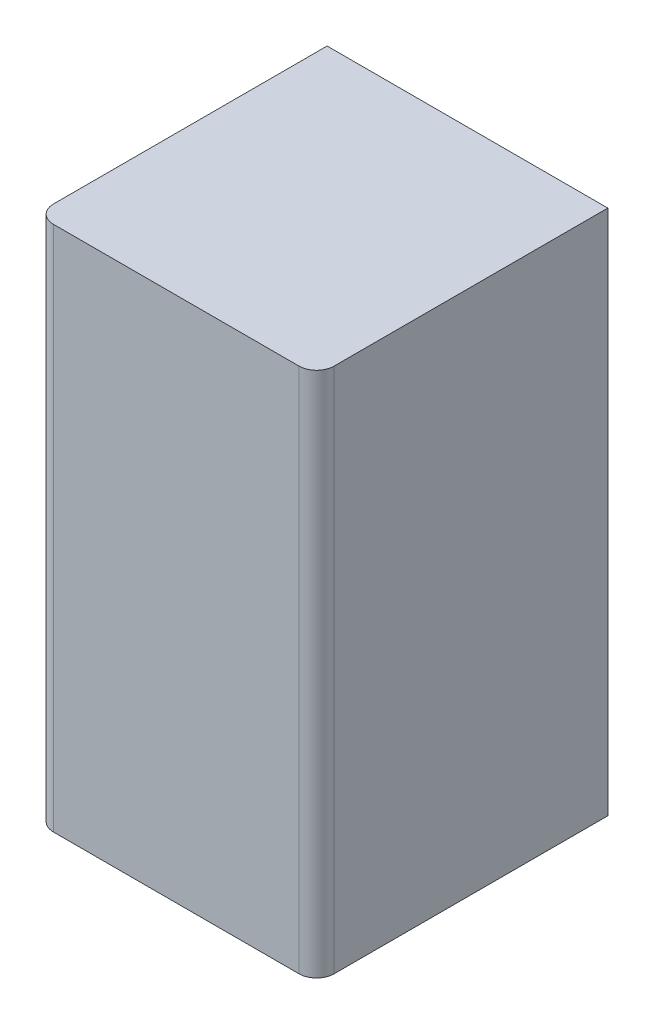
ISO-10303-21;
HEADER;
FILE_DESCRIPTION(('STEP AP214'),'2;1');
FILE_NAME('part.step','',(''),(''),'','','');
FILE_SCHEMA(('AUTOMOTIVE_DESIGN { 1 0 10303 214 1 1 1 1 }'));
ENDSEC;
DATA;
#1=APPLICATION_CONTEXT('core data for automotive mechanical design processes');
#2=APPLICATION_PROTOCOL_DEFINITION('international standard','automotive_design',2000,#1);
#3=PRODUCT_CONTEXT('',#1,'mechanical');
#4=PRODUCT('Part','Part','',(#3));
#5=PRODUCT_RELATED_PRODUCT_CATEGORY('part','',(#4));
#6=PRODUCT_DEFINITION_FORMATION('','',#4);
#7=PRODUCT_DEFINITION_CONTEXT('part definition',#1,'design');
#8=PRODUCT_DEFINITION('design','',#6,#7);
#9=PRODUCT_DEFINITION_SHAPE('','',#8);
#10=(LENGTH_UNIT() NAMED_UNIT(*) SI_UNIT(.MILLI.,.METRE.));
#11=(NAMED_UNIT(*) PLANE_ANGLE_UNIT() SI_UNIT($,.RADIAN.));
#12=(NAMED_UNIT(*) SI_UNIT($,.STERADIAN.) SOLID_ANGLE_UNIT());
#13=UNCERTAINTY_MEASURE_WITH_UNIT(LENGTH_MEASURE(1.E-05),#10,'distance_accuracy_value','');
#14=(GEOMETRIC_REPRESENTATION_CONTEXT(3) GLOBAL_UNCERTAINTY_ASSIGNED_CONTEXT((#13)) GLOBAL_UNIT_ASSIGNED_CONTEXT((#10,
#11,#12)) REPRESENTATION_CONTEXT('',''));
#15=CARTESIAN_POINT('',(0.,0.,0.));
#16=DIRECTION('',(0.,0.,1.));
#17=DIRECTION('',(1.,0.,0.));
#18=AXIS2_PLACEMENT_3D('',#15,#16,#17);
#19=CARTESIAN_POINT('',(-8.,15.,0.1));
#20=DIRECTION('',(1.,0.,0.));
#21=DIRECTION('',(0.,1.,0.));
#22=AXIS2_PLACEMENT_3D('',#19,#20,#21);
#23=PLANE('',#22);
#24=DIRECTION('',(0.,0.,-1.));
#25=VECTOR('',#24,1.);
#26=CARTESIAN_POINT('',(-7.99999999999999,-15.,0.1));
#27=LINE('',#26,#25);
#28=CARTESIAN_POINT('',(-7.99999999999999,-15.,15.6));
#29=VERTEX_POINT('',#28);
#30=CARTESIAN_POINT('',(-7.99999999999999,-15.,0.));
#31=VERTEX_POINT('',#30);
#32=EDGE_CURVE('E87',#29,#31,#27,.T.);
#33=ORIENTED_EDGE('',*,*,#32,.F.);
#34=DIRECTION('',(0.,-1.,0.));
#35=VECTOR('',#34,1.);
#36=CARTESIAN_POINT('',(-8.,15.,15.6));
#37=LINE('',#36,#35);
#38=CARTESIAN_POINT('',(-8.,15.,15.6));
#39=VERTEX_POINT('',#38);
#40=EDGE_CURVE('E58',#29,#39,#37,.F.);
#41=ORIENTED_EDGE('',*,*,#40,.T.);
#42=DIRECTION('',(0.,0.,-1.));
#43=VECTOR('',#42,1.);
#44=CARTESIAN_POINT('',(-8.,15.,0.1));
#45=LINE('',#44,#43);
#46=CARTESIAN_POINT('',(-8.,15.,0.));
#47=VERTEX_POINT('',#46);
#48=EDGE_CURVE('E107',#39,#47,#45,.T.);
#49=ORIENTED_EDGE('',*,*,#48,.T.);
#50=DIRECTION('',(0.,-1.,0.));
#51=VECTOR('',#50,1.);
#52=CARTESIAN_POINT('',(-8.,15.,0.));
#53=LINE('',#52,#51);
#54=EDGE_CURVE('E103',#47,#31,#53,.T.);
#55=ORIENTED_EDGE('',*,*,#54,.T.);
#56=EDGE_LOOP('',(#33,#41,#49,#55));
#57=FACE_BOUND('',#56,.T.);
#58=ADVANCED_FACE('F35',(#57),#23,.F.);
#59=CARTESIAN_POINT('',(-7.99999999999999,-15.,0.1));
#60=DIRECTION('',(0.,1.,0.));
#61=DIRECTION('',(-1.,0.,0.));
#62=AXIS2_PLACEMENT_3D('',#59,#60,#61);
#63=PLANE('',#62);
#64=DIRECTION('',(1.,0.,0.));
#65=VECTOR('',#64,1.);
#66=CARTESIAN_POINT('',(-8.,-15.,16.6));
#67=LINE('',#66,#65);
#68=CARTESIAN_POINT('',(-6.99999999999999,-15.,16.6));
#69=VERTEX_POINT('',#68);
#70=CARTESIAN_POINT('',(7.00000000000001,-15.,16.6));
#71=VERTEX_POINT('',#70);
#72=EDGE_CURVE('E112',#69,#71,#67,.T.);
#73=ORIENTED_EDGE('',*,*,#72,.F.);
#74=CARTESIAN_POINT('',(-6.99999999999999,-15.,15.6));
#75=DIRECTION('',(0.,1.,0.));
#76=DIRECTION('',(-1.,0.,0.));
#77=AXIS2_PLACEMENT_3D('',#74,#75,#76);
#78=CIRCLE('',#77,1.);
#79=EDGE_CURVE('E94',#69,#29,#78,.F.);
#80=ORIENTED_EDGE('',*,*,#79,.T.);
#81=ORIENTED_EDGE('',*,*,#32,.T.);
#82=DIRECTION('',(1.,0.,0.));
#83=VECTOR('',#82,1.);
#84=CARTESIAN_POINT('',(-7.99999999999999,-15.,0.));
#85=LINE('',#84,#83);
#86=CARTESIAN_POINT('',(8.00000000000001,-15.,0.));
#87=VERTEX_POINT('',#86);
#88=EDGE_CURVE('E92',#31,#87,#85,.T.);
#89=ORIENTED_EDGE('',*,*,#88,.T.);
#90=DIRECTION('',(0.,0.,-1.));
#91=VECTOR('',#90,1.);
#92=CARTESIAN_POINT('',(8.00000000000001,-15.,0.1));
#93=LINE('',#92,#91);
#94=CARTESIAN_POINT('',(8.00000000000001,-15.,15.6));
#95=VERTEX_POINT('',#94);
#96=EDGE_CURVE('E97',#95,#87,#93,.T.);
#97=ORIENTED_EDGE('',*,*,#96,.F.);
#98=CARTESIAN_POINT('',(7.00000000000001,-15.,15.6));
#99=DIRECTION('',(0.,1.,0.));
#100=DIRECTION('',(-1.,0.,0.));
#101=AXIS2_PLACEMENT_3D('',#98,#99,#100);
#102=CIRCLE('',#101,1.);
#103=EDGE_CURVE('E128',#95,#71,#102,.F.);
#104=ORIENTED_EDGE('',*,*,#103,.T.);
#105=EDGE_LOOP('',(#73,#80,#81,#89,#97,#104));
#106=FACE_BOUND('',#105,.T.);
#107=ADVANCED_FACE('F90',(#106),#63,.F.);
#108=CARTESIAN_POINT('',(8.00000000000001,-15.,0.1));
#109=DIRECTION('',(-1.,0.,0.));
#110=DIRECTION('',(0.,-1.,0.));
#111=AXIS2_PLACEMENT_3D('',#108,#109,#110);
#112=PLANE('',#111);
#113=DIRECTION('',(0.,0.,-1.));
#114=VECTOR('',#113,1.);
#115=CARTESIAN_POINT('',(8.,15.,0.1));
#116=LINE('',#115,#114);
#117=CARTESIAN_POINT('',(8.,15.,15.6));
#118=VERTEX_POINT('',#117);
#119=CARTESIAN_POINT('',(8.,15.,0.));
#120=VERTEX_POINT('',#119);
#121=EDGE_CURVE('E120',#118,#120,#116,.T.);
#122=ORIENTED_EDGE('',*,*,#121,.F.);
#123=DIRECTION('',(0.,1.,0.));
#124=VECTOR('',#123,1.);
#125=CARTESIAN_POINT('',(8.00000000000001,-15.,15.6));
#126=LINE('',#125,#124);
#127=EDGE_CURVE('E11',#118,#95,#126,.F.);
#128=ORIENTED_EDGE('',*,*,#127,.T.);
#129=ORIENTED_EDGE('',*,*,#96,.T.);
#130=DIRECTION('',(0.,1.,0.));
#131=VECTOR('',#130,1.);
#132=CARTESIAN_POINT('',(8.00000000000001,-15.,0.));
#133=LINE('',#132,#131);
#134=EDGE_CURVE('E105',#87,#120,#133,.T.);
#135=ORIENTED_EDGE('',*,*,#134,.T.);
#136=EDGE_LOOP('',(#122,#128,#129,#135));
#137=FACE_BOUND('',#136,.T.);
#138=ADVANCED_FACE('F153',(#137),#112,.F.);
#139=CARTESIAN_POINT('',(-8.,15.,0.1));
#140=DIRECTION('',(0.,-1.,0.));
#141=DIRECTION('',(1.,0.,0.));
#142=AXIS2_PLACEMENT_3D('',#139,#140,#141);
#143=PLANE('',#142);
#144=ORIENTED_EDGE('',*,*,#48,.F.);
#145=CARTESIAN_POINT('',(-7.,15.,15.6));
#146=DIRECTION('',(0.,-1.,0.));
#147=DIRECTION('',(1.,0.,0.));
#148=AXIS2_PLACEMENT_3D('',#145,#146,#147);
#149=CIRCLE('',#148,1.);
#150=CARTESIAN_POINT('',(-7.,15.,16.6));
#151=VERTEX_POINT('',#150);
#152=EDGE_CURVE('E43',#39,#151,#149,.F.);
#153=ORIENTED_EDGE('',*,*,#152,.T.);
#154=DIRECTION('',(-1.,0.,0.));
#155=VECTOR('',#154,1.);
#156=CARTESIAN_POINT('',(-8.,15.,16.6));
#157=LINE('',#156,#155);
#158=CARTESIAN_POINT('',(7.,15.,16.6));
#159=VERTEX_POINT('',#158);
#160=EDGE_CURVE('E109',#159,#151,#157,.T.);
#161=ORIENTED_EDGE('',*,*,#160,.F.);
#162=CARTESIAN_POINT('',(7.,15.,15.6));
#163=DIRECTION('',(0.,-1.,0.));
#164=DIRECTION('',(1.,0.,0.));
#165=AXIS2_PLACEMENT_3D('',#162,#163,#164);
#166=CIRCLE('',#165,1.);
#167=EDGE_CURVE('E50',#159,#118,#166,.F.);
#168=ORIENTED_EDGE('',*,*,#167,.T.);
#169=ORIENTED_EDGE('',*,*,#121,.T.);
#170=DIRECTION('',(-1.,0.,0.));
#171=VECTOR('',#170,1.);
#172=CARTESIAN_POINT('',(-8.,15.,0.));
#173=LINE('',#172,#171);
#174=EDGE_CURVE('E117',#120,#47,#173,.T.);
#175=ORIENTED_EDGE('',*,*,#174,.T.);
#176=EDGE_LOOP('',(#144,#153,#161,#168,#169,#175));
#177=FACE_BOUND('',#176,.T.);
#178=ADVANCED_FACE('F133',(#177),#143,.F.);
#179=CARTESIAN_POINT('',(-7.99999999999999,-15.,0.));
#180=DIRECTION('',(0.,0.,1.));
#181=DIRECTION('',(1.,0.,0.));
#182=AXIS2_PLACEMENT_3D('',#179,#180,#181);
#183=PLANE('',#182);
#184=ORIENTED_EDGE('',*,*,#54,.F.);
#185=ORIENTED_EDGE('',*,*,#174,.F.);
#186=ORIENTED_EDGE('',*,*,#134,.F.);
#187=ORIENTED_EDGE('',*,*,#88,.F.);
#188=EDGE_LOOP('',(#184,#185,#186,#187));
#189=FACE_BOUND('',#188,.T.);
#190=ADVANCED_FACE('F101',(#189),#183,.F.);
#191=CARTESIAN_POINT('',(-8.,15.,16.6));
#192=DIRECTION('',(0.,0.,1.));
#193=DIRECTION('',(1.,0.,0.));
#194=AXIS2_PLACEMENT_3D('',#191,#192,#193);
#195=PLANE('',#194);
#196=ORIENTED_EDGE('',*,*,#160,.T.);
#197=DIRECTION('',(0.,-1.,0.));
#198=VECTOR('',#197,1.);
#199=CARTESIAN_POINT('',(-6.99999999999999,-15.,16.6));
#200=LINE('',#199,#198);
#201=EDGE_CURVE('E125',#151,#69,#200,.T.);
#202=ORIENTED_EDGE('',*,*,#201,.T.);
#203=ORIENTED_EDGE('',*,*,#72,.T.);
#204=DIRECTION('',(0.,1.,0.));
#205=VECTOR('',#204,1.);
#206=CARTESIAN_POINT('',(7.,15.,16.6));
#207=LINE('',#206,#205);
#208=EDGE_CURVE('E96',#71,#159,#207,.T.);
#209=ORIENTED_EDGE('',*,*,#208,.T.);
#210=EDGE_LOOP('',(#196,#202,#203,#209));
#211=FACE_BOUND('',#210,.T.);
#212=ADVANCED_FACE('F137',(#211),#195,.T.);
#213=CARTESIAN_POINT('',(-7.,15.,15.6));
#214=DIRECTION('',(0.,1.,0.));
#215=DIRECTION('',(-1.,0.,0.));
#216=AXIS2_PLACEMENT_3D('',#213,#214,#215);
#217=CYLINDRICAL_SURFACE('',#216,1.);
#218=ORIENTED_EDGE('',*,*,#152,.F.);
#219=ORIENTED_EDGE('',*,*,#40,.F.);
#220=ORIENTED_EDGE('',*,*,#79,.F.);
#221=ORIENTED_EDGE('',*,*,#201,.F.);
#222=EDGE_LOOP('',(#218,#219,#220,#221));
#223=FACE_BOUND('',#222,.T.);
#224=ADVANCED_FACE('F140',(#223),#217,.T.);
#225=CARTESIAN_POINT('',(7.,15.,15.6));
#226=DIRECTION('',(0.,-1.,0.));
#227=DIRECTION('',(1.,0.,0.));
#228=AXIS2_PLACEMENT_3D('',#225,#226,#227);
#229=CYLINDRICAL_SURFACE('',#228,1.);
#230=ORIENTED_EDGE('',*,*,#103,.F.);
#231=ORIENTED_EDGE('',*,*,#127,.F.);
#232=ORIENTED_EDGE('',*,*,#167,.F.);
#233=ORIENTED_EDGE('',*,*,#208,.F.);
#234=EDGE_LOOP('',(#230,#231,#232,#233));
#235=FACE_BOUND('',#234,.T.);
#236=ADVANCED_FACE('F37',(#235),#229,.T.);
#237=CLOSED_SHELL('',(#58,#107,#138,#178,#190,#212,#224,#236));
#238=MANIFOLD_SOLID_BREP('B2',#237);
#239=ADVANCED_BREP_SHAPE_REPRESENTATION('',(#18,#238),#14);
#240=SHAPE_DEFINITION_REPRESENTATION(#9,#239);
ENDSEC;
END-ISO-10303-21;
